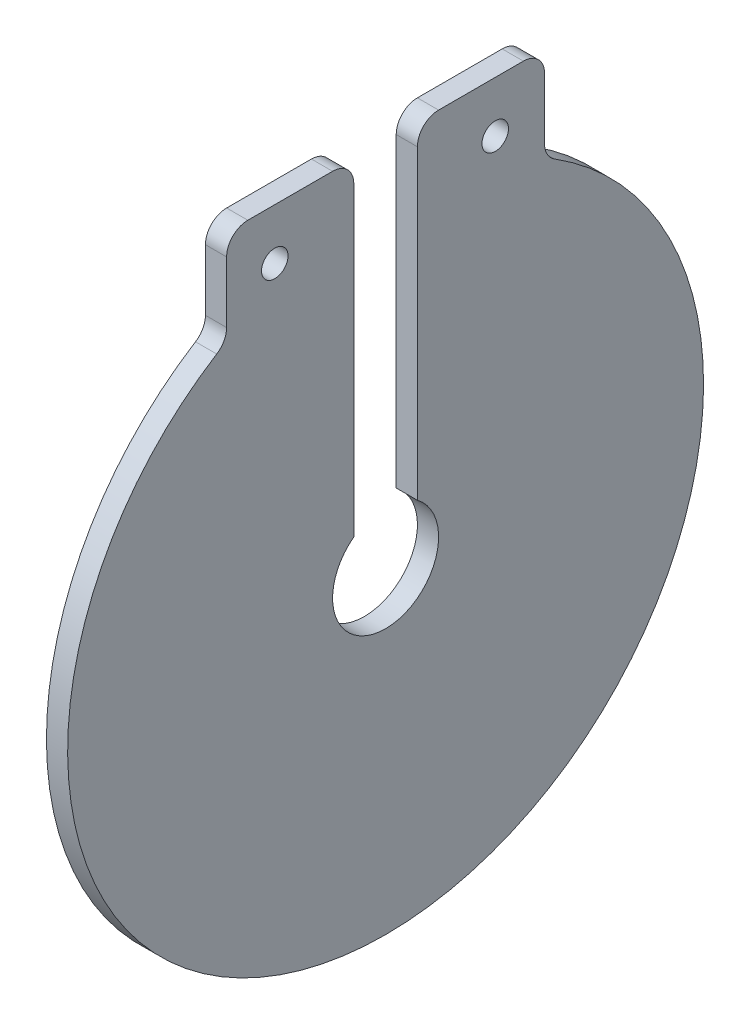
ISO-10303-21;
HEADER;
FILE_DESCRIPTION(('STEP AP214'),'2;1');
FILE_NAME('part.step','',(''),(''),'','','');
FILE_SCHEMA(('AUTOMOTIVE_DESIGN { 1 0 10303 214 1 1 1 1 }'));
ENDSEC;
DATA;
#1=APPLICATION_CONTEXT('core data for automotive mechanical design processes');
#2=APPLICATION_PROTOCOL_DEFINITION('international standard','automotive_design',2000,#1);
#3=PRODUCT_CONTEXT('',#1,'mechanical');
#4=PRODUCT('Part','Part','',(#3));
#5=PRODUCT_RELATED_PRODUCT_CATEGORY('part','',(#4));
#6=PRODUCT_DEFINITION_FORMATION('','',#4);
#7=PRODUCT_DEFINITION_CONTEXT('part definition',#1,'design');
#8=PRODUCT_DEFINITION('design','',#6,#7);
#9=PRODUCT_DEFINITION_SHAPE('','',#8);
#10=(LENGTH_UNIT() NAMED_UNIT(*) SI_UNIT(.MILLI.,.METRE.));
#11=(NAMED_UNIT(*) PLANE_ANGLE_UNIT() SI_UNIT($,.RADIAN.));
#12=(NAMED_UNIT(*) SI_UNIT($,.STERADIAN.) SOLID_ANGLE_UNIT());
#13=UNCERTAINTY_MEASURE_WITH_UNIT(LENGTH_MEASURE(1.E-05),#10,'distance_accuracy_value','');
#14=(GEOMETRIC_REPRESENTATION_CONTEXT(3) GLOBAL_UNCERTAINTY_ASSIGNED_CONTEXT((#13)) GLOBAL_UNIT_ASSIGNED_CONTEXT((#10,
#11,#12)) REPRESENTATION_CONTEXT('',''));
#15=CARTESIAN_POINT('',(0.,0.,0.));
#16=DIRECTION('',(0.,0.,1.));
#17=DIRECTION('',(1.,0.,0.));
#18=AXIS2_PLACEMENT_3D('',#15,#16,#17);
#19=CARTESIAN_POINT('',(0.,34.8807621135332,15.));
#20=DIRECTION('',(0.,1.,0.));
#21=DIRECTION('',(0.,0.,1.));
#22=AXIS2_PLACEMENT_3D('',#19,#20,#21);
#23=PLANE('',#22);
#24=DIRECTION('',(0.,0.,1.));
#25=VECTOR('',#24,1.);
#26=CARTESIAN_POINT('',(2.,34.8807621135332,15.));
#27=LINE('',#26,#25);
#28=CARTESIAN_POINT('',(2.,34.8807621135332,5.));
#29=VERTEX_POINT('',#28);
#30=CARTESIAN_POINT('',(2.,34.8807621135332,13.));
#31=VERTEX_POINT('',#30);
#32=EDGE_CURVE('E232',#29,#31,#27,.T.);
#33=ORIENTED_EDGE('',*,*,#32,.F.);
#34=DIRECTION('',(1.,0.,0.));
#35=VECTOR('',#34,1.);
#36=CARTESIAN_POINT('',(0.,34.8807621135332,5.));
#37=LINE('',#36,#35);
#38=CARTESIAN_POINT('',(0.,34.8807621135332,5.));
#39=VERTEX_POINT('',#38);
#40=EDGE_CURVE('E215',#29,#39,#37,.F.);
#41=ORIENTED_EDGE('',*,*,#40,.T.);
#42=DIRECTION('',(0.,0.,1.));
#43=VECTOR('',#42,1.);
#44=CARTESIAN_POINT('',(0.,34.8807621135332,15.));
#45=LINE('',#44,#43);
#46=CARTESIAN_POINT('',(0.,34.8807621135332,13.));
#47=VERTEX_POINT('',#46);
#48=EDGE_CURVE('E167',#39,#47,#45,.T.);
#49=ORIENTED_EDGE('',*,*,#48,.T.);
#50=DIRECTION('',(1.,0.,0.));
#51=VECTOR('',#50,1.);
#52=CARTESIAN_POINT('',(0.,34.8807621135332,13.));
#53=LINE('',#52,#51);
#54=EDGE_CURVE('E213',#47,#31,#53,.T.);
#55=ORIENTED_EDGE('',*,*,#54,.T.);
#56=EDGE_LOOP('',(#33,#41,#49,#55));
#57=FACE_BOUND('',#56,.T.);
#58=ADVANCED_FACE('F34',(#57),#23,.T.);
#59=CARTESIAN_POINT('',(2.,0.,0.));
#60=DIRECTION('',(-1.,0.,0.));
#61=DIRECTION('',(0.,0.,1.));
#62=AXIS2_PLACEMENT_3D('',#59,#60,#61);
#63=CYLINDRICAL_SURFACE('',#62,30.);
#64=CARTESIAN_POINT('',(2.,0.,0.));
#65=DIRECTION('',(1.,0.,0.));
#66=DIRECTION('',(0.,0.,-1.));
#67=AXIS2_PLACEMENT_3D('',#64,#65,#66);
#68=CIRCLE('',#67,30.);
#69=CARTESIAN_POINT('',(2.,25.4164532094862,15.9375));
#70=VERTEX_POINT('',#69);
#71=CARTESIAN_POINT('',(2.,25.4164532094862,-15.9375));
#72=VERTEX_POINT('',#71);
#73=EDGE_CURVE('E171',#70,#72,#68,.T.);
#74=ORIENTED_EDGE('',*,*,#73,.F.);
#75=DIRECTION('',(-1.,0.,0.));
#76=VECTOR('',#75,1.);
#77=CARTESIAN_POINT('',(2.,25.4164532094862,15.9375));
#78=LINE('',#77,#76);
#79=CARTESIAN_POINT('',(0.,25.4164532094862,15.9375));
#80=VERTEX_POINT('',#79);
#81=EDGE_CURVE('E184',#70,#80,#78,.T.);
#82=ORIENTED_EDGE('',*,*,#81,.T.);
#83=CARTESIAN_POINT('',(0.,0.,0.));
#84=DIRECTION('',(1.,0.,0.));
#85=DIRECTION('',(0.,0.,-1.));
#86=AXIS2_PLACEMENT_3D('',#83,#84,#85);
#87=CIRCLE('',#86,30.);
#88=CARTESIAN_POINT('',(0.,25.4164532094862,-15.9375));
#89=VERTEX_POINT('',#88);
#90=EDGE_CURVE('E164',#80,#89,#87,.T.);
#91=ORIENTED_EDGE('',*,*,#90,.T.);
#92=DIRECTION('',(-1.,0.,0.));
#93=VECTOR('',#92,1.);
#94=CARTESIAN_POINT('',(2.,25.4164532094862,-15.9375));
#95=LINE('',#94,#93);
#96=EDGE_CURVE('E181',#89,#72,#95,.F.);
#97=ORIENTED_EDGE('',*,*,#96,.T.);
#98=EDGE_LOOP('',(#74,#82,#91,#97));
#99=FACE_BOUND('',#98,.T.);
#100=ADVANCED_FACE('F243',(#99),#63,.T.);
#101=CARTESIAN_POINT('',(2.,0.,0.));
#102=DIRECTION('',(1.,0.,0.));
#103=DIRECTION('',(0.,0.,-1.));
#104=AXIS2_PLACEMENT_3D('',#101,#102,#103);
#105=PLANE('',#104);
#106=CARTESIAN_POINT('',(2.,30.0807621135332,10.4556028661762));
#107=DIRECTION('',(1.,0.,0.));
#108=DIRECTION('',(0.,0.,-1.));
#109=AXIS2_PLACEMENT_3D('',#106,#107,#108);
#110=CIRCLE('',#109,1.25);
#111=CARTESIAN_POINT('',(2.,30.0807621135332,9.2056028661762));
#112=VERTEX_POINT('',#111);
#113=EDGE_CURVE('E449',#112,#112,#110,.T.);
#114=ORIENTED_EDGE('',*,*,#113,.F.);
#115=EDGE_LOOP('',(#114));
#116=FACE_BOUND('',#115,.T.);
#117=CARTESIAN_POINT('',(2.,30.0807621135332,-10.3443971338238));
#118=DIRECTION('',(1.,0.,0.));
#119=DIRECTION('',(0.,0.,-1.));
#120=AXIS2_PLACEMENT_3D('',#117,#118,#119);
#121=CIRCLE('',#120,1.25);
#122=CARTESIAN_POINT('',(2.,30.0807621135332,-11.5943971338238));
#123=VERTEX_POINT('',#122);
#124=EDGE_CURVE('E274',#123,#123,#121,.T.);
#125=ORIENTED_EDGE('',*,*,#124,.F.);
#126=EDGE_LOOP('',(#125));
#127=FACE_BOUND('',#126,.T.);
#128=CARTESIAN_POINT('',(2.,34.8807621135332,-13.));
#129=VERTEX_POINT('',#128);
#130=CARTESIAN_POINT('',(2.,34.8807621135332,-5.));
#131=VERTEX_POINT('',#130);
#132=EDGE_CURVE('E256',#129,#131,#27,.T.);
#133=ORIENTED_EDGE('',*,*,#132,.T.);
#134=CARTESIAN_POINT('',(2.,32.8807621135332,-5.));
#135=DIRECTION('',(1.,0.,0.));
#136=DIRECTION('',(0.,0.,-1.));
#137=AXIS2_PLACEMENT_3D('',#134,#135,#136);
#138=CIRCLE('',#137,2.);
#139=CARTESIAN_POINT('',(2.,32.8807621135332,-3.));
#140=VERTEX_POINT('',#139);
#141=EDGE_CURVE('E210',#131,#140,#138,.T.);
#142=ORIENTED_EDGE('',*,*,#141,.T.);
#143=DIRECTION('',(0.,1.,0.));
#144=VECTOR('',#143,1.);
#145=CARTESIAN_POINT('',(2.,38.3726995578938,-3.));
#146=LINE('',#145,#144);
#147=CARTESIAN_POINT('',(2.,4.,-3.));
#148=VERTEX_POINT('',#147);
#149=EDGE_CURVE('E145',#148,#140,#146,.T.);
#150=ORIENTED_EDGE('',*,*,#149,.F.);
#151=CARTESIAN_POINT('',(2.,0.,0.));
#152=DIRECTION('',(1.,0.,0.));
#153=DIRECTION('',(0.,0.,-1.));
#154=AXIS2_PLACEMENT_3D('',#151,#152,#153);
#155=CIRCLE('',#154,5.);
#156=CARTESIAN_POINT('',(2.,4.,3.));
#157=VERTEX_POINT('',#156);
#158=EDGE_CURVE('E152',#157,#148,#155,.T.);
#159=ORIENTED_EDGE('',*,*,#158,.F.);
#160=DIRECTION('',(0.,-1.,0.));
#161=VECTOR('',#160,1.);
#162=CARTESIAN_POINT('',(2.,38.3726995578938,3.));
#163=LINE('',#162,#161);
#164=CARTESIAN_POINT('',(2.,32.8807621135332,3.));
#165=VERTEX_POINT('',#164);
#166=EDGE_CURVE('E136',#165,#157,#163,.T.);
#167=ORIENTED_EDGE('',*,*,#166,.F.);
#168=CARTESIAN_POINT('',(2.,32.8807621135332,5.));
#169=DIRECTION('',(1.,0.,0.));
#170=DIRECTION('',(0.,0.,-1.));
#171=AXIS2_PLACEMENT_3D('',#168,#169,#170);
#172=CIRCLE('',#171,2.);
#173=EDGE_CURVE('E57',#165,#29,#172,.T.);
#174=ORIENTED_EDGE('',*,*,#173,.T.);
#175=ORIENTED_EDGE('',*,*,#32,.T.);
#176=CARTESIAN_POINT('',(2.,32.8807621135332,13.));
#177=DIRECTION('',(1.,0.,0.));
#178=DIRECTION('',(0.,0.,-1.));
#179=AXIS2_PLACEMENT_3D('',#176,#177,#178);
#180=CIRCLE('',#179,2.);
#181=CARTESIAN_POINT('',(2.,32.8807621135332,15.));
#182=VERTEX_POINT('',#181);
#183=EDGE_CURVE('E49',#31,#182,#180,.T.);
#184=ORIENTED_EDGE('',*,*,#183,.T.);
#185=DIRECTION('',(0.,-1.,0.));
#186=VECTOR('',#185,1.);
#187=CARTESIAN_POINT('',(2.,34.8807621135332,15.));
#188=LINE('',#187,#186);
#189=CARTESIAN_POINT('',(2.,27.1108834234519,15.));
#190=VERTEX_POINT('',#189);
#191=EDGE_CURVE('E155',#182,#190,#188,.T.);
#192=ORIENTED_EDGE('',*,*,#191,.T.);
#193=CARTESIAN_POINT('',(2.,27.1108834234519,17.));
#194=DIRECTION('',(1.,0.,0.));
#195=DIRECTION('',(0.,0.,-1.));
#196=AXIS2_PLACEMENT_3D('',#193,#194,#195);
#197=CIRCLE('',#196,2.);
#198=EDGE_CURVE('E217',#190,#70,#197,.F.);
#199=ORIENTED_EDGE('',*,*,#198,.T.);
#200=ORIENTED_EDGE('',*,*,#73,.T.);
#201=CARTESIAN_POINT('',(2.,27.1108834234519,-17.));
#202=DIRECTION('',(1.,0.,0.));
#203=DIRECTION('',(0.,0.,-1.));
#204=AXIS2_PLACEMENT_3D('',#201,#202,#203);
#205=CIRCLE('',#204,2.);
#206=CARTESIAN_POINT('',(2.,27.1108834234519,-15.));
#207=VERTEX_POINT('',#206);
#208=EDGE_CURVE('E42',#72,#207,#205,.F.);
#209=ORIENTED_EDGE('',*,*,#208,.T.);
#210=DIRECTION('',(0.,1.,0.));
#211=VECTOR('',#210,1.);
#212=CARTESIAN_POINT('',(2.,34.8807621135332,-15.));
#213=LINE('',#212,#211);
#214=CARTESIAN_POINT('',(2.,32.8807621135332,-15.));
#215=VERTEX_POINT('',#214);
#216=EDGE_CURVE('E222',#207,#215,#213,.T.);
#217=ORIENTED_EDGE('',*,*,#216,.T.);
#218=CARTESIAN_POINT('',(2.,32.8807621135332,-13.));
#219=DIRECTION('',(1.,0.,0.));
#220=DIRECTION('',(0.,0.,-1.));
#221=AXIS2_PLACEMENT_3D('',#218,#219,#220);
#222=CIRCLE('',#221,2.);
#223=EDGE_CURVE('E207',#215,#129,#222,.T.);
#224=ORIENTED_EDGE('',*,*,#223,.T.);
#225=EDGE_LOOP('',(#133,#142,#150,#159,#167,#174,#175,#184,#192,#199,#200,#209,#217,#224));
#226=FACE_BOUND('',#225,.T.);
#227=ADVANCED_FACE('F160',(#116,#127,#226),#105,.T.);
#228=CARTESIAN_POINT('',(0.,0.,0.));
#229=DIRECTION('',(1.,0.,0.));
#230=DIRECTION('',(0.,0.,-1.));
#231=AXIS2_PLACEMENT_3D('',#228,#229,#230);
#232=PLANE('',#231);
#233=CARTESIAN_POINT('',(0.,30.0807621135332,10.4556028661762));
#234=DIRECTION('',(1.,0.,0.));
#235=DIRECTION('',(0.,0.,-1.));
#236=AXIS2_PLACEMENT_3D('',#233,#234,#235);
#237=CIRCLE('',#236,1.25);
#238=CARTESIAN_POINT('',(0.,30.0807621135332,9.2056028661762));
#239=VERTEX_POINT('',#238);
#240=EDGE_CURVE('E146',#239,#239,#237,.T.);
#241=ORIENTED_EDGE('',*,*,#240,.T.);
#242=EDGE_LOOP('',(#241));
#243=FACE_BOUND('',#242,.T.);
#244=CARTESIAN_POINT('',(0.,30.0807621135332,-10.3443971338238));
#245=DIRECTION('',(1.,0.,0.));
#246=DIRECTION('',(0.,0.,-1.));
#247=AXIS2_PLACEMENT_3D('',#244,#245,#246);
#248=CIRCLE('',#247,1.25);
#249=CARTESIAN_POINT('',(0.,30.0807621135332,-11.5943971338238));
#250=VERTEX_POINT('',#249);
#251=EDGE_CURVE('E450',#250,#250,#248,.T.);
#252=ORIENTED_EDGE('',*,*,#251,.T.);
#253=EDGE_LOOP('',(#252));
#254=FACE_BOUND('',#253,.T.);
#255=DIRECTION('',(0.,1.,0.));
#256=VECTOR('',#255,1.);
#257=CARTESIAN_POINT('',(0.,38.3726995578938,-3.));
#258=LINE('',#257,#256);
#259=CARTESIAN_POINT('',(0.,4.,-3.));
#260=VERTEX_POINT('',#259);
#261=CARTESIAN_POINT('',(0.,32.8807621135332,-3.));
#262=VERTEX_POINT('',#261);
#263=EDGE_CURVE('E269',#260,#262,#258,.T.);
#264=ORIENTED_EDGE('',*,*,#263,.T.);
#265=CARTESIAN_POINT('',(0.,32.8807621135332,-5.));
#266=DIRECTION('',(1.,0.,0.));
#267=DIRECTION('',(0.,0.,-1.));
#268=AXIS2_PLACEMENT_3D('',#265,#266,#267);
#269=CIRCLE('',#268,2.);
#270=CARTESIAN_POINT('',(0.,34.8807621135332,-5.));
#271=VERTEX_POINT('',#270);
#272=EDGE_CURVE('E200',#262,#271,#269,.F.);
#273=ORIENTED_EDGE('',*,*,#272,.T.);
#274=CARTESIAN_POINT('',(0.,34.8807621135332,-13.));
#275=VERTEX_POINT('',#274);
#276=EDGE_CURVE('E162',#275,#271,#45,.T.);
#277=ORIENTED_EDGE('',*,*,#276,.F.);
#278=CARTESIAN_POINT('',(0.,32.8807621135332,-13.));
#279=DIRECTION('',(1.,0.,0.));
#280=DIRECTION('',(0.,0.,-1.));
#281=AXIS2_PLACEMENT_3D('',#278,#279,#280);
#282=CIRCLE('',#281,2.);
#283=CARTESIAN_POINT('',(0.,32.8807621135332,-15.));
#284=VERTEX_POINT('',#283);
#285=EDGE_CURVE('E196',#275,#284,#282,.F.);
#286=ORIENTED_EDGE('',*,*,#285,.T.);
#287=DIRECTION('',(0.,1.,0.));
#288=VECTOR('',#287,1.);
#289=CARTESIAN_POINT('',(0.,34.8807621135332,-15.));
#290=LINE('',#289,#288);
#291=CARTESIAN_POINT('',(0.,27.1108834234519,-15.));
#292=VERTEX_POINT('',#291);
#293=EDGE_CURVE('E241',#292,#284,#290,.T.);
#294=ORIENTED_EDGE('',*,*,#293,.F.);
#295=CARTESIAN_POINT('',(0.,27.1108834234519,-17.));
#296=DIRECTION('',(1.,0.,0.));
#297=DIRECTION('',(0.,0.,-1.));
#298=AXIS2_PLACEMENT_3D('',#295,#296,#297);
#299=CIRCLE('',#298,2.);
#300=EDGE_CURVE('E11',#292,#89,#299,.T.);
#301=ORIENTED_EDGE('',*,*,#300,.T.);
#302=ORIENTED_EDGE('',*,*,#90,.F.);
#303=CARTESIAN_POINT('',(0.,27.1108834234519,17.));
#304=DIRECTION('',(1.,0.,0.));
#305=DIRECTION('',(0.,0.,-1.));
#306=AXIS2_PLACEMENT_3D('',#303,#304,#305);
#307=CIRCLE('',#306,2.);
#308=CARTESIAN_POINT('',(0.,27.1108834234519,15.));
#309=VERTEX_POINT('',#308);
#310=EDGE_CURVE('E219',#80,#309,#307,.T.);
#311=ORIENTED_EDGE('',*,*,#310,.T.);
#312=DIRECTION('',(0.,-1.,0.));
#313=VECTOR('',#312,1.);
#314=CARTESIAN_POINT('',(0.,34.8807621135332,15.));
#315=LINE('',#314,#313);
#316=CARTESIAN_POINT('',(0.,32.8807621135332,15.));
#317=VERTEX_POINT('',#316);
#318=EDGE_CURVE('E250',#317,#309,#315,.T.);
#319=ORIENTED_EDGE('',*,*,#318,.F.);
#320=CARTESIAN_POINT('',(0.,32.8807621135332,13.));
#321=DIRECTION('',(1.,0.,0.));
#322=DIRECTION('',(0.,0.,-1.));
#323=AXIS2_PLACEMENT_3D('',#320,#321,#322);
#324=CIRCLE('',#323,2.);
#325=EDGE_CURVE('E194',#317,#47,#324,.F.);
#326=ORIENTED_EDGE('',*,*,#325,.T.);
#327=ORIENTED_EDGE('',*,*,#48,.F.);
#328=CARTESIAN_POINT('',(0.,32.8807621135332,5.));
#329=DIRECTION('',(1.,0.,0.));
#330=DIRECTION('',(0.,0.,-1.));
#331=AXIS2_PLACEMENT_3D('',#328,#329,#330);
#332=CIRCLE('',#331,2.);
#333=CARTESIAN_POINT('',(0.,32.8807621135332,3.));
#334=VERTEX_POINT('',#333);
#335=EDGE_CURVE('E198',#39,#334,#332,.F.);
#336=ORIENTED_EDGE('',*,*,#335,.T.);
#337=DIRECTION('',(0.,-1.,0.));
#338=VECTOR('',#337,1.);
#339=CARTESIAN_POINT('',(0.,38.3726995578938,3.));
#340=LINE('',#339,#338);
#341=CARTESIAN_POINT('',(0.,4.,3.));
#342=VERTEX_POINT('',#341);
#343=EDGE_CURVE('E268',#334,#342,#340,.T.);
#344=ORIENTED_EDGE('',*,*,#343,.T.);
#345=CARTESIAN_POINT('',(0.,0.,0.));
#346=DIRECTION('',(1.,0.,0.));
#347=DIRECTION('',(0.,0.,-1.));
#348=AXIS2_PLACEMENT_3D('',#345,#346,#347);
#349=CIRCLE('',#348,5.);
#350=EDGE_CURVE('E154',#342,#260,#349,.T.);
#351=ORIENTED_EDGE('',*,*,#350,.T.);
#352=EDGE_LOOP('',(#264,#273,#277,#286,#294,#301,#302,#311,#319,#326,#327,#336,#344,#351));
#353=FACE_BOUND('',#352,.T.);
#354=ADVANCED_FACE('F239',(#243,#254,#353),#232,.F.);
#355=CARTESIAN_POINT('',(0.,0.,0.));
#356=DIRECTION('',(1.,0.,0.));
#357=DIRECTION('',(0.,0.,-1.));
#358=AXIS2_PLACEMENT_3D('',#355,#356,#357);
#359=CYLINDRICAL_SURFACE('',#358,5.);
#360=ORIENTED_EDGE('',*,*,#350,.F.);
#361=DIRECTION('',(1.,0.,0.));
#362=VECTOR('',#361,1.);
#363=CARTESIAN_POINT('',(0.,4.,3.));
#364=LINE('',#363,#362);
#365=EDGE_CURVE('E140',#342,#157,#364,.T.);
#366=ORIENTED_EDGE('',*,*,#365,.T.);
#367=ORIENTED_EDGE('',*,*,#158,.T.);
#368=DIRECTION('',(1.,0.,0.));
#369=VECTOR('',#368,1.);
#370=CARTESIAN_POINT('',(0.,4.,-3.));
#371=LINE('',#370,#369);
#372=EDGE_CURVE('E156',#148,#260,#371,.F.);
#373=ORIENTED_EDGE('',*,*,#372,.T.);
#374=EDGE_LOOP('',(#360,#366,#367,#373));
#375=FACE_BOUND('',#374,.T.);
#376=ADVANCED_FACE('F150',(#375),#359,.F.);
#377=CARTESIAN_POINT('',(0.,34.8807621135332,15.));
#378=DIRECTION('',(0.,0.,1.));
#379=DIRECTION('',(0.,-1.,0.));
#380=AXIS2_PLACEMENT_3D('',#377,#378,#379);
#381=PLANE('',#380);
#382=ORIENTED_EDGE('',*,*,#318,.T.);
#383=DIRECTION('',(-1.,0.,0.));
#384=VECTOR('',#383,1.);
#385=CARTESIAN_POINT('',(0.,27.1108834234519,15.));
#386=LINE('',#385,#384);
#387=EDGE_CURVE('E178',#309,#190,#386,.F.);
#388=ORIENTED_EDGE('',*,*,#387,.T.);
#389=ORIENTED_EDGE('',*,*,#191,.F.);
#390=DIRECTION('',(1.,0.,0.));
#391=VECTOR('',#390,1.);
#392=CARTESIAN_POINT('',(0.,32.8807621135332,15.));
#393=LINE('',#392,#391);
#394=EDGE_CURVE('E174',#182,#317,#393,.F.);
#395=ORIENTED_EDGE('',*,*,#394,.T.);
#396=EDGE_LOOP('',(#382,#388,#389,#395));
#397=FACE_BOUND('',#396,.T.);
#398=ADVANCED_FACE('F253',(#397),#381,.T.);
#399=ORIENTED_EDGE('',*,*,#276,.T.);
#400=DIRECTION('',(-1.,0.,0.));
#401=VECTOR('',#400,1.);
#402=CARTESIAN_POINT('',(2.,34.8807621135332,-5.));
#403=LINE('',#402,#401);
#404=EDGE_CURVE('E204',#271,#131,#403,.F.);
#405=ORIENTED_EDGE('',*,*,#404,.T.);
#406=ORIENTED_EDGE('',*,*,#132,.F.);
#407=DIRECTION('',(1.,0.,0.));
#408=VECTOR('',#407,1.);
#409=CARTESIAN_POINT('',(0.,34.8807621135332,-13.));
#410=LINE('',#409,#408);
#411=EDGE_CURVE('E202',#129,#275,#410,.F.);
#412=ORIENTED_EDGE('',*,*,#411,.T.);
#413=EDGE_LOOP('',(#399,#405,#406,#412));
#414=FACE_BOUND('',#413,.T.);
#415=ADVANCED_FACE('F286',(#414),#23,.T.);
#416=CARTESIAN_POINT('',(0.,34.8807621135332,-15.));
#417=DIRECTION('',(0.,0.,-1.));
#418=DIRECTION('',(0.,1.,0.));
#419=AXIS2_PLACEMENT_3D('',#416,#417,#418);
#420=PLANE('',#419);
#421=ORIENTED_EDGE('',*,*,#216,.F.);
#422=DIRECTION('',(-1.,0.,0.));
#423=VECTOR('',#422,1.);
#424=CARTESIAN_POINT('',(0.,27.1108834234519,-15.));
#425=LINE('',#424,#423);
#426=EDGE_CURVE('E189',#207,#292,#425,.T.);
#427=ORIENTED_EDGE('',*,*,#426,.T.);
#428=ORIENTED_EDGE('',*,*,#293,.T.);
#429=DIRECTION('',(1.,0.,0.));
#430=VECTOR('',#429,1.);
#431=CARTESIAN_POINT('',(0.,32.8807621135332,-15.));
#432=LINE('',#431,#430);
#433=EDGE_CURVE('E186',#284,#215,#432,.T.);
#434=ORIENTED_EDGE('',*,*,#433,.T.);
#435=EDGE_LOOP('',(#421,#427,#428,#434));
#436=FACE_BOUND('',#435,.T.);
#437=ADVANCED_FACE('F228',(#436),#420,.T.);
#438=CARTESIAN_POINT('',(0.,38.3726995578938,-3.));
#439=DIRECTION('',(0.,0.,-1.));
#440=DIRECTION('',(0.,1.,0.));
#441=AXIS2_PLACEMENT_3D('',#438,#439,#440);
#442=PLANE('',#441);
#443=ORIENTED_EDGE('',*,*,#149,.T.);
#444=DIRECTION('',(-1.,0.,0.));
#445=VECTOR('',#444,1.);
#446=CARTESIAN_POINT('',(0.,32.8807621135332,-3.));
#447=LINE('',#446,#445);
#448=EDGE_CURVE('E191',#140,#262,#447,.T.);
#449=ORIENTED_EDGE('',*,*,#448,.T.);
#450=ORIENTED_EDGE('',*,*,#263,.F.);
#451=ORIENTED_EDGE('',*,*,#372,.F.);
#452=EDGE_LOOP('',(#443,#449,#450,#451));
#453=FACE_BOUND('',#452,.T.);
#454=ADVANCED_FACE('F278',(#453),#442,.F.);
#455=CARTESIAN_POINT('',(0.,38.3726995578938,3.));
#456=DIRECTION('',(0.,0.,1.));
#457=DIRECTION('',(0.,-1.,0.));
#458=AXIS2_PLACEMENT_3D('',#455,#456,#457);
#459=PLANE('',#458);
#460=ORIENTED_EDGE('',*,*,#343,.F.);
#461=DIRECTION('',(1.,0.,0.));
#462=VECTOR('',#461,1.);
#463=CARTESIAN_POINT('',(2.,32.8807621135332,3.));
#464=LINE('',#463,#462);
#465=EDGE_CURVE('E143',#334,#165,#464,.T.);
#466=ORIENTED_EDGE('',*,*,#465,.T.);
#467=ORIENTED_EDGE('',*,*,#166,.T.);
#468=ORIENTED_EDGE('',*,*,#365,.F.);
#469=EDGE_LOOP('',(#460,#466,#467,#468));
#470=FACE_BOUND('',#469,.T.);
#471=ADVANCED_FACE('F139',(#470),#459,.F.);
#472=CARTESIAN_POINT('',(2.,27.1108834234519,17.));
#473=DIRECTION('',(-1.,0.,0.));
#474=DIRECTION('',(0.,0.,1.));
#475=AXIS2_PLACEMENT_3D('',#472,#473,#474);
#476=CYLINDRICAL_SURFACE('',#475,2.);
#477=ORIENTED_EDGE('',*,*,#310,.F.);
#478=ORIENTED_EDGE('',*,*,#81,.F.);
#479=ORIENTED_EDGE('',*,*,#198,.F.);
#480=ORIENTED_EDGE('',*,*,#387,.F.);
#481=EDGE_LOOP('',(#477,#478,#479,#480));
#482=FACE_BOUND('',#481,.T.);
#483=ADVANCED_FACE('F246',(#482),#476,.F.);
#484=CARTESIAN_POINT('',(2.,27.1108834234519,-17.));
#485=DIRECTION('',(-1.,0.,0.));
#486=DIRECTION('',(0.,0.,1.));
#487=AXIS2_PLACEMENT_3D('',#484,#485,#486);
#488=CYLINDRICAL_SURFACE('',#487,2.);
#489=ORIENTED_EDGE('',*,*,#300,.F.);
#490=ORIENTED_EDGE('',*,*,#426,.F.);
#491=ORIENTED_EDGE('',*,*,#208,.F.);
#492=ORIENTED_EDGE('',*,*,#96,.F.);
#493=EDGE_LOOP('',(#489,#490,#491,#492));
#494=FACE_BOUND('',#493,.T.);
#495=ADVANCED_FACE('F235',(#494),#488,.F.);
#496=CARTESIAN_POINT('',(0.,32.8807621135332,-5.));
#497=DIRECTION('',(1.,0.,0.));
#498=DIRECTION('',(0.,0.,-1.));
#499=AXIS2_PLACEMENT_3D('',#496,#497,#498);
#500=CYLINDRICAL_SURFACE('',#499,2.);
#501=ORIENTED_EDGE('',*,*,#141,.F.);
#502=ORIENTED_EDGE('',*,*,#404,.F.);
#503=ORIENTED_EDGE('',*,*,#272,.F.);
#504=ORIENTED_EDGE('',*,*,#448,.F.);
#505=EDGE_LOOP('',(#501,#502,#503,#504));
#506=FACE_BOUND('',#505,.T.);
#507=ADVANCED_FACE('F282',(#506),#500,.T.);
#508=CARTESIAN_POINT('',(0.,32.8807621135332,5.));
#509=DIRECTION('',(-1.,0.,0.));
#510=DIRECTION('',(0.,0.,1.));
#511=AXIS2_PLACEMENT_3D('',#508,#509,#510);
#512=CYLINDRICAL_SURFACE('',#511,2.);
#513=ORIENTED_EDGE('',*,*,#335,.F.);
#514=ORIENTED_EDGE('',*,*,#40,.F.);
#515=ORIENTED_EDGE('',*,*,#173,.F.);
#516=ORIENTED_EDGE('',*,*,#465,.F.);
#517=EDGE_LOOP('',(#513,#514,#515,#516));
#518=FACE_BOUND('',#517,.T.);
#519=ADVANCED_FACE('F267',(#518),#512,.T.);
#520=CARTESIAN_POINT('',(0.,32.8807621135332,-13.));
#521=DIRECTION('',(1.,0.,0.));
#522=DIRECTION('',(0.,0.,-1.));
#523=AXIS2_PLACEMENT_3D('',#520,#521,#522);
#524=CYLINDRICAL_SURFACE('',#523,2.);
#525=ORIENTED_EDGE('',*,*,#285,.F.);
#526=ORIENTED_EDGE('',*,*,#411,.F.);
#527=ORIENTED_EDGE('',*,*,#223,.F.);
#528=ORIENTED_EDGE('',*,*,#433,.F.);
#529=EDGE_LOOP('',(#525,#526,#527,#528));
#530=FACE_BOUND('',#529,.T.);
#531=ADVANCED_FACE('F290',(#530),#524,.T.);
#532=CARTESIAN_POINT('',(0.,32.8807621135332,13.));
#533=DIRECTION('',(1.,0.,0.));
#534=DIRECTION('',(0.,0.,-1.));
#535=AXIS2_PLACEMENT_3D('',#532,#533,#534);
#536=CYLINDRICAL_SURFACE('',#535,2.);
#537=ORIENTED_EDGE('',*,*,#325,.F.);
#538=ORIENTED_EDGE('',*,*,#394,.F.);
#539=ORIENTED_EDGE('',*,*,#183,.F.);
#540=ORIENTED_EDGE('',*,*,#54,.F.);
#541=EDGE_LOOP('',(#537,#538,#539,#540));
#542=FACE_BOUND('',#541,.T.);
#543=ADVANCED_FACE('F36',(#542),#536,.T.);
#544=CARTESIAN_POINT('',(0.,30.0807621135332,-10.3443971338238));
#545=DIRECTION('',(1.,0.,0.));
#546=DIRECTION('',(0.,0.,-1.));
#547=AXIS2_PLACEMENT_3D('',#544,#545,#546);
#548=CYLINDRICAL_SURFACE('',#547,1.25);
#549=ORIENTED_EDGE('',*,*,#251,.F.);
#550=EDGE_LOOP('',(#549));
#551=FACE_BOUND('',#550,.T.);
#552=ORIENTED_EDGE('',*,*,#124,.T.);
#553=EDGE_LOOP('',(#552));
#554=FACE_BOUND('',#553,.T.);
#555=ADVANCED_FACE('F296',(#551,#554),#548,.F.);
#556=CARTESIAN_POINT('',(0.,30.0807621135332,10.4556028661762));
#557=DIRECTION('',(1.,0.,0.));
#558=DIRECTION('',(0.,0.,-1.));
#559=AXIS2_PLACEMENT_3D('',#556,#557,#558);
#560=CYLINDRICAL_SURFACE('',#559,1.25);
#561=ORIENTED_EDGE('',*,*,#240,.F.);
#562=EDGE_LOOP('',(#561));
#563=FACE_BOUND('',#562,.T.);
#564=ORIENTED_EDGE('',*,*,#113,.T.);
#565=EDGE_LOOP('',(#564));
#566=FACE_BOUND('',#565,.T.);
#567=ADVANCED_FACE('F371',(#563,#566),#560,.F.);
#568=CLOSED_SHELL('',(#58,#100,#227,#354,#376,#398,#415,#437,#454,#471,#483,#495,#507,#519,#531,
#543,#555,#567));
#569=MANIFOLD_SOLID_BREP('B2',#568);
#570=ADVANCED_BREP_SHAPE_REPRESENTATION('',(#18,#569),#14);
#571=SHAPE_DEFINITION_REPRESENTATION(#9,#570);
ENDSEC;
END-ISO-10303-21;
